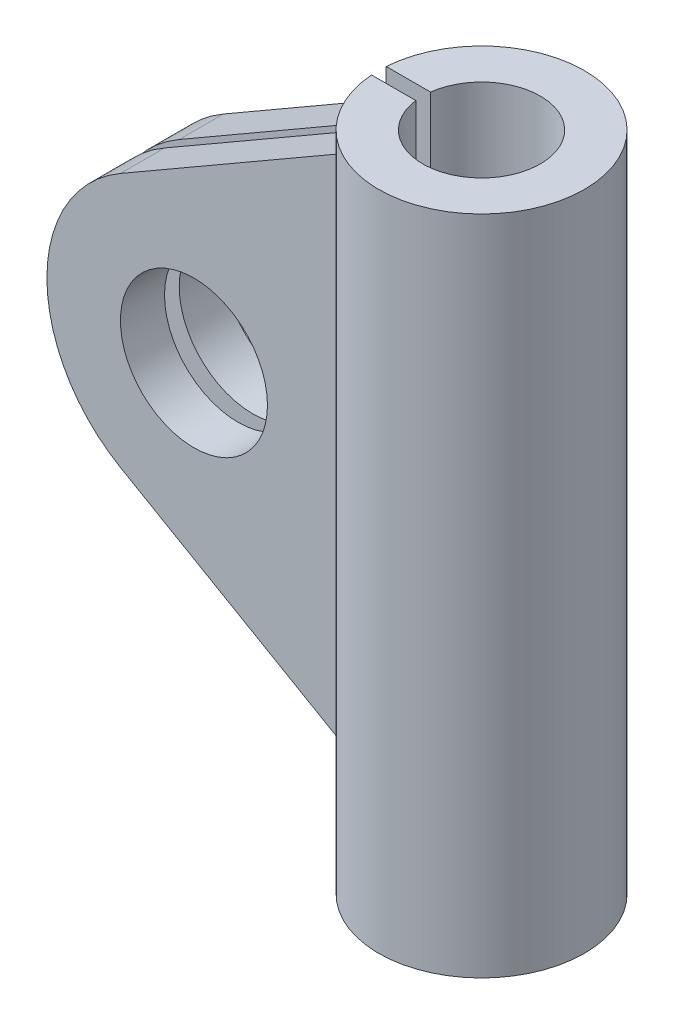
ISO-10303-21;
HEADER;
FILE_DESCRIPTION(('STEP AP214'),'2;1');
FILE_NAME('part.step','',(''),(''),'','','');
FILE_SCHEMA(('AUTOMOTIVE_DESIGN { 1 0 10303 214 1 1 1 1 }'));
ENDSEC;
DATA;
#1=APPLICATION_CONTEXT('core data for automotive mechanical design processes');
#2=APPLICATION_PROTOCOL_DEFINITION('international standard','automotive_design',2000,#1);
#3=PRODUCT_CONTEXT('',#1,'mechanical');
#4=PRODUCT('Part','Part','',(#3));
#5=PRODUCT_RELATED_PRODUCT_CATEGORY('part','',(#4));
#6=PRODUCT_DEFINITION_FORMATION('','',#4);
#7=PRODUCT_DEFINITION_CONTEXT('part definition',#1,'design');
#8=PRODUCT_DEFINITION('design','',#6,#7);
#9=PRODUCT_DEFINITION_SHAPE('','',#8);
#10=(LENGTH_UNIT() NAMED_UNIT(*) SI_UNIT(.MILLI.,.METRE.));
#11=(NAMED_UNIT(*) PLANE_ANGLE_UNIT() SI_UNIT($,.RADIAN.));
#12=(NAMED_UNIT(*) SI_UNIT($,.STERADIAN.) SOLID_ANGLE_UNIT());
#13=UNCERTAINTY_MEASURE_WITH_UNIT(LENGTH_MEASURE(1.E-05),#10,'distance_accuracy_value','');
#14=(GEOMETRIC_REPRESENTATION_CONTEXT(3) GLOBAL_UNCERTAINTY_ASSIGNED_CONTEXT((#13)) GLOBAL_UNIT_ASSIGNED_CONTEXT((#10,
#11,#12)) REPRESENTATION_CONTEXT('',''));
#15=CARTESIAN_POINT('',(0.,0.,0.));
#16=DIRECTION('',(0.,0.,1.));
#17=DIRECTION('',(1.,0.,0.));
#18=AXIS2_PLACEMENT_3D('',#15,#16,#17);
#19=CARTESIAN_POINT('',(0.,0.,7.));
#20=DIRECTION('',(0.,0.,-1.));
#21=DIRECTION('',(-1.,0.,0.));
#22=AXIS2_PLACEMENT_3D('',#19,#20,#21);
#23=CYLINDRICAL_SURFACE('',#22,10.);
#24=CARTESIAN_POINT('',(0.,0.,4.));
#25=DIRECTION('',(0.,0.,-1.));
#26=DIRECTION('',(-1.,0.,0.));
#27=AXIS2_PLACEMENT_3D('',#24,#25,#26);
#28=CIRCLE('',#27,10.);
#29=CARTESIAN_POINT('',(-5.00000000000005,-8.66025403784437,4.));
#30=VERTEX_POINT('',#29);
#31=CARTESIAN_POINT('',(-5.00000000000004,8.66025403784436,4.));
#32=VERTEX_POINT('',#31);
#33=EDGE_CURVE('E219',#30,#32,#28,.T.);
#34=ORIENTED_EDGE('',*,*,#33,.F.);
#35=DIRECTION('',(0.,0.,-1.));
#36=VECTOR('',#35,1.);
#37=CARTESIAN_POINT('',(-5.00000000000004,-8.66025403784437,7.));
#38=LINE('',#37,#36);
#39=CARTESIAN_POINT('',(-5.00000000000004,-8.66025403784437,7.));
#40=VERTEX_POINT('',#39);
#41=EDGE_CURVE('E11',#40,#30,#38,.T.);
#42=ORIENTED_EDGE('',*,*,#41,.F.);
#43=CARTESIAN_POINT('',(0.,0.,7.));
#44=DIRECTION('',(0.,0.,1.));
#45=DIRECTION('',(1.,0.,0.));
#46=AXIS2_PLACEMENT_3D('',#43,#44,#45);
#47=CIRCLE('',#46,10.);
#48=CARTESIAN_POINT('',(-5.00000000000004,8.66025403784436,7.));
#49=VERTEX_POINT('',#48);
#50=EDGE_CURVE('E108',#49,#40,#47,.T.);
#51=ORIENTED_EDGE('',*,*,#50,.F.);
#52=DIRECTION('',(0.,0.,-1.));
#53=VECTOR('',#52,1.);
#54=CARTESIAN_POINT('',(-5.00000000000004,8.66025403784436,7.));
#55=LINE('',#54,#53);
#56=EDGE_CURVE('E62',#49,#32,#55,.T.);
#57=ORIENTED_EDGE('',*,*,#56,.T.);
#58=EDGE_LOOP('',(#34,#42,#51,#57));
#59=FACE_BOUND('',#58,.T.);
#60=ADVANCED_FACE('F37',(#59),#23,.T.);
#61=CARTESIAN_POINT('',(-5.00000000000005,-8.66025403784437,7.));
#62=DIRECTION('',(0.500000000000004,0.866025403784436,0.));
#63=DIRECTION('',(-0.866025403784436,0.500000000000004,0.));
#64=AXIS2_PLACEMENT_3D('',#61,#62,#63);
#65=PLANE('',#64);
#66=DIRECTION('',(-0.866025403784436,0.500000000000004,0.));
#67=VECTOR('',#66,1.);
#68=CARTESIAN_POINT('',(-5.00000000000005,-8.66025403784437,4.));
#69=LINE('',#68,#67);
#70=CARTESIAN_POINT('',(9.0800578046066,-16.7893792015396,4.));
#71=VERTEX_POINT('',#70);
#72=EDGE_CURVE('E169',#71,#30,#69,.T.);
#73=ORIENTED_EDGE('',*,*,#72,.F.);
#74=CARTESIAN_POINT('',(16.0621778264911,-20.8205080756889,3.5));
#75=DIRECTION('',(0.500000000000004,0.866025403784436,0.));
#76=DIRECTION('',(-0.866025403784436,0.500000000000004,0.));
#77=AXIS2_PLACEMENT_3D('',#74,#75,#76);
#78=ELLIPSE('',#77,8.08290376865478,7.);
#79=CARTESIAN_POINT('',(10.,-17.3205080756889,7.));
#80=VERTEX_POINT('',#79);
#81=EDGE_CURVE('E164',#71,#80,#78,.T.);
#82=ORIENTED_EDGE('',*,*,#81,.T.);
#83=DIRECTION('',(0.866025403784436,-0.500000000000004,0.));
#84=VECTOR('',#83,1.);
#85=CARTESIAN_POINT('',(-5.00000000000005,-8.66025403784437,7.));
#86=LINE('',#85,#84);
#87=EDGE_CURVE('E112',#40,#80,#86,.T.);
#88=ORIENTED_EDGE('',*,*,#87,.F.);
#89=ORIENTED_EDGE('',*,*,#41,.T.);
#90=EDGE_LOOP('',(#73,#82,#88,#89));
#91=FACE_BOUND('',#90,.T.);
#92=ADVANCED_FACE('F166',(#91),#65,.F.);
#93=CARTESIAN_POINT('',(-5.00000000000004,8.66025403784436,7.));
#94=DIRECTION('',(-0.500000000000004,0.866025403784436,0.));
#95=DIRECTION('',(-0.866025403784436,-0.500000000000004,0.));
#96=AXIS2_PLACEMENT_3D('',#93,#94,#95);
#97=PLANE('',#96);
#98=CARTESIAN_POINT('',(16.0621778264911,20.8205080756889,3.5));
#99=DIRECTION('',(-0.500000000000004,0.866025403784436,0.));
#100=DIRECTION('',(0.866025403784436,0.500000000000004,0.));
#101=AXIS2_PLACEMENT_3D('',#98,#99,#100);
#102=ELLIPSE('',#101,8.08290376865478,7.);
#103=CARTESIAN_POINT('',(9.08005780460661,16.7893792015396,4.));
#104=VERTEX_POINT('',#103);
#105=CARTESIAN_POINT('',(10.,17.3205080756889,7.));
#106=VERTEX_POINT('',#105);
#107=EDGE_CURVE('E179',#104,#106,#102,.T.);
#108=ORIENTED_EDGE('',*,*,#107,.F.);
#109=DIRECTION('',(-0.866025403784436,-0.500000000000004,0.));
#110=VECTOR('',#109,1.);
#111=CARTESIAN_POINT('',(-5.00000000000004,8.66025403784436,4.));
#112=LINE('',#111,#110);
#113=EDGE_CURVE('E188',#104,#32,#112,.T.);
#114=ORIENTED_EDGE('',*,*,#113,.T.);
#115=ORIENTED_EDGE('',*,*,#56,.F.);
#116=DIRECTION('',(0.866025403784436,0.500000000000005,0.));
#117=VECTOR('',#116,1.);
#118=CARTESIAN_POINT('',(-5.00000000000004,8.66025403784436,7.));
#119=LINE('',#118,#117);
#120=EDGE_CURVE('E91',#49,#106,#119,.T.);
#121=ORIENTED_EDGE('',*,*,#120,.T.);
#122=EDGE_LOOP('',(#108,#114,#115,#121));
#123=FACE_BOUND('',#122,.T.);
#124=ADVANCED_FACE('F187',(#123),#97,.T.);
#125=CARTESIAN_POINT('',(16.0621778264911,-25.,3.5));
#126=DIRECTION('',(0.,1.,0.));
#127=DIRECTION('',(0.,0.,1.));
#128=AXIS2_PLACEMENT_3D('',#125,#126,#127);
#129=CYLINDRICAL_SURFACE('',#128,7.);
#130=CARTESIAN_POINT('',(16.0621778264911,20.,3.5));
#131=DIRECTION('',(0.,1.,0.));
#132=DIRECTION('',(0.,0.,1.));
#133=AXIS2_PLACEMENT_3D('',#130,#131,#132);
#134=CIRCLE('',#133,7.);
#135=CARTESIAN_POINT('',(9.0800578046066,20.,4.));
#136=VERTEX_POINT('',#135);
#137=CARTESIAN_POINT('',(9.0800578046066,20.,3.));
#138=VERTEX_POINT('',#137);
#139=EDGE_CURVE('E192',#136,#138,#134,.T.);
#140=ORIENTED_EDGE('',*,*,#139,.F.);
#141=DIRECTION('',(0.,1.,0.));
#142=VECTOR('',#141,1.);
#143=CARTESIAN_POINT('',(9.0800578046066,-25.,4.));
#144=LINE('',#143,#142);
#145=EDGE_CURVE('E217',#136,#104,#144,.F.);
#146=ORIENTED_EDGE('',*,*,#145,.T.);
#147=ORIENTED_EDGE('',*,*,#107,.T.);
#148=DIRECTION('',(0.,-1.,0.));
#149=VECTOR('',#148,1.);
#150=CARTESIAN_POINT('',(10.,0.,7.));
#151=LINE('',#150,#149);
#152=EDGE_CURVE('E174',#106,#80,#151,.T.);
#153=ORIENTED_EDGE('',*,*,#152,.T.);
#154=ORIENTED_EDGE('',*,*,#81,.F.);
#155=CARTESIAN_POINT('',(9.0800578046066,-25.,4.));
#156=VERTEX_POINT('',#155);
#157=EDGE_CURVE('E211',#71,#156,#144,.F.);
#158=ORIENTED_EDGE('',*,*,#157,.T.);
#159=CARTESIAN_POINT('',(16.0621778264911,-25.,3.5));
#160=DIRECTION('',(0.,1.,0.));
#161=DIRECTION('',(0.,0.,1.));
#162=AXIS2_PLACEMENT_3D('',#159,#160,#161);
#163=CIRCLE('',#162,7.);
#164=CARTESIAN_POINT('',(9.0800578046066,-25.,3.));
#165=VERTEX_POINT('',#164);
#166=EDGE_CURVE('E189',#156,#165,#163,.T.);
#167=ORIENTED_EDGE('',*,*,#166,.T.);
#168=DIRECTION('',(0.,1.,0.));
#169=VECTOR('',#168,1.);
#170=CARTESIAN_POINT('',(9.0800578046066,-25.,3.));
#171=LINE('',#170,#169);
#172=CARTESIAN_POINT('',(9.0800578046066,-16.7893792015396,3.));
#173=VERTEX_POINT('',#172);
#174=EDGE_CURVE('E197',#173,#165,#171,.F.);
#175=ORIENTED_EDGE('',*,*,#174,.F.);
#176=CARTESIAN_POINT('',(10.,-17.3205080756889,0.));
#177=VERTEX_POINT('',#176);
#178=EDGE_CURVE('E102',#177,#173,#78,.T.);
#179=ORIENTED_EDGE('',*,*,#178,.F.);
#180=DIRECTION('',(0.,-1.,0.));
#181=VECTOR('',#180,1.);
#182=CARTESIAN_POINT('',(10.,0.,0.));
#183=LINE('',#182,#181);
#184=CARTESIAN_POINT('',(10.,17.3205080756889,0.));
#185=VERTEX_POINT('',#184);
#186=EDGE_CURVE('E109',#185,#177,#183,.T.);
#187=ORIENTED_EDGE('',*,*,#186,.F.);
#188=CARTESIAN_POINT('',(9.08005780460661,16.7893792015396,3.));
#189=VERTEX_POINT('',#188);
#190=EDGE_CURVE('E107',#185,#189,#102,.T.);
#191=ORIENTED_EDGE('',*,*,#190,.T.);
#192=EDGE_CURVE('E203',#138,#189,#171,.F.);
#193=ORIENTED_EDGE('',*,*,#192,.F.);
#194=EDGE_LOOP('',(#140,#146,#147,#153,#154,#158,#167,#175,#179,#187,#191,#193));
#195=FACE_BOUND('',#194,.T.);
#196=ADVANCED_FACE('F176',(#195),#129,.T.);
#197=CARTESIAN_POINT('',(16.0621778264911,-25.,3.5));
#198=DIRECTION('',(0.,1.,0.));
#199=DIRECTION('',(0.,0.,1.));
#200=AXIS2_PLACEMENT_3D('',#197,#198,#199);
#201=PLANE('',#200);
#202=DIRECTION('',(-1.,0.,0.));
#203=VECTOR('',#202,1.);
#204=CARTESIAN_POINT('',(16.0621778264911,-25.,4.));
#205=LINE('',#204,#203);
#206=CARTESIAN_POINT('',(12.0935508598942,-25.,4.));
#207=VERTEX_POINT('',#206);
#208=EDGE_CURVE('E207',#207,#156,#205,.T.);
#209=ORIENTED_EDGE('',*,*,#208,.F.);
#210=CARTESIAN_POINT('',(16.0621778264911,-25.,3.5));
#211=DIRECTION('',(0.,1.,0.));
#212=DIRECTION('',(0.,0.,1.));
#213=AXIS2_PLACEMENT_3D('',#210,#211,#212);
#214=CIRCLE('',#213,4.);
#215=CARTESIAN_POINT('',(12.0935508598942,-25.,3.));
#216=VERTEX_POINT('',#215);
#217=EDGE_CURVE('E222',#207,#216,#214,.T.);
#218=ORIENTED_EDGE('',*,*,#217,.T.);
#219=DIRECTION('',(-1.,0.,0.));
#220=VECTOR('',#219,1.);
#221=CARTESIAN_POINT('',(16.0621778264911,-25.,3.));
#222=LINE('',#221,#220);
#223=EDGE_CURVE('E201',#216,#165,#222,.T.);
#224=ORIENTED_EDGE('',*,*,#223,.T.);
#225=ORIENTED_EDGE('',*,*,#166,.F.);
#226=EDGE_LOOP('',(#209,#218,#224,#225));
#227=FACE_BOUND('',#226,.T.);
#228=ADVANCED_FACE('F248',(#227),#201,.F.);
#229=CARTESIAN_POINT('',(16.0621778264911,20.,3.5));
#230=DIRECTION('',(0.,1.,0.));
#231=DIRECTION('',(0.,0.,1.));
#232=AXIS2_PLACEMENT_3D('',#229,#230,#231);
#233=PLANE('',#232);
#234=CARTESIAN_POINT('',(16.0621778264911,20.,3.5));
#235=DIRECTION('',(0.,1.,0.));
#236=DIRECTION('',(0.,0.,1.));
#237=AXIS2_PLACEMENT_3D('',#234,#235,#236);
#238=CIRCLE('',#237,4.);
#239=CARTESIAN_POINT('',(12.0935508598942,20.,4.));
#240=VERTEX_POINT('',#239);
#241=CARTESIAN_POINT('',(12.0935508598942,20.,3.));
#242=VERTEX_POINT('',#241);
#243=EDGE_CURVE('E53',#240,#242,#238,.T.);
#244=ORIENTED_EDGE('',*,*,#243,.F.);
#245=DIRECTION('',(-1.,0.,0.));
#246=VECTOR('',#245,1.);
#247=CARTESIAN_POINT('',(0.,20.,4.));
#248=LINE('',#247,#246);
#249=EDGE_CURVE('E232',#240,#136,#248,.T.);
#250=ORIENTED_EDGE('',*,*,#249,.T.);
#251=ORIENTED_EDGE('',*,*,#139,.T.);
#252=DIRECTION('',(-1.,0.,0.));
#253=VECTOR('',#252,1.);
#254=CARTESIAN_POINT('',(0.,20.,3.));
#255=LINE('',#254,#253);
#256=EDGE_CURVE('E230',#242,#138,#255,.T.);
#257=ORIENTED_EDGE('',*,*,#256,.F.);
#258=EDGE_LOOP('',(#244,#250,#251,#257));
#259=FACE_BOUND('',#258,.T.);
#260=ADVANCED_FACE('F229',(#259),#233,.T.);
#261=CARTESIAN_POINT('',(0.,0.,3.));
#262=DIRECTION('',(0.,0.,-1.));
#263=DIRECTION('',(-1.,0.,0.));
#264=AXIS2_PLACEMENT_3D('',#261,#262,#263);
#265=CIRCLE('',#264,10.);
#266=CARTESIAN_POINT('',(-5.00000000000005,-8.66025403784437,3.));
#267=VERTEX_POINT('',#266);
#268=CARTESIAN_POINT('',(-5.00000000000004,8.66025403784436,3.));
#269=VERTEX_POINT('',#268);
#270=EDGE_CURVE('E86',#267,#269,#265,.T.);
#271=ORIENTED_EDGE('',*,*,#270,.T.);
#272=CARTESIAN_POINT('',(-5.00000000000004,8.66025403784436,0.));
#273=VERTEX_POINT('',#272);
#274=EDGE_CURVE('E80',#269,#273,#55,.T.);
#275=ORIENTED_EDGE('',*,*,#274,.T.);
#276=CARTESIAN_POINT('',(0.,0.,0.));
#277=DIRECTION('',(0.,0.,1.));
#278=DIRECTION('',(1.,0.,0.));
#279=AXIS2_PLACEMENT_3D('',#276,#277,#278);
#280=CIRCLE('',#279,10.);
#281=CARTESIAN_POINT('',(-5.00000000000004,-8.66025403784437,0.));
#282=VERTEX_POINT('',#281);
#283=EDGE_CURVE('E83',#273,#282,#280,.T.);
#284=ORIENTED_EDGE('',*,*,#283,.T.);
#285=EDGE_CURVE('E46',#267,#282,#38,.T.);
#286=ORIENTED_EDGE('',*,*,#285,.F.);
#287=EDGE_LOOP('',(#271,#275,#284,#286));
#288=FACE_BOUND('',#287,.T.);
#289=ADVANCED_FACE('F39',(#288),#23,.T.);
#290=ORIENTED_EDGE('',*,*,#178,.T.);
#291=DIRECTION('',(-0.866025403784436,0.500000000000004,0.));
#292=VECTOR('',#291,1.);
#293=CARTESIAN_POINT('',(-5.00000000000005,-8.66025403784437,3.));
#294=LINE('',#293,#292);
#295=EDGE_CURVE('E125',#173,#267,#294,.T.);
#296=ORIENTED_EDGE('',*,*,#295,.T.);
#297=ORIENTED_EDGE('',*,*,#285,.T.);
#298=DIRECTION('',(0.866025403784436,-0.500000000000004,0.));
#299=VECTOR('',#298,1.);
#300=CARTESIAN_POINT('',(-5.00000000000005,-8.66025403784437,0.));
#301=LINE('',#300,#299);
#302=EDGE_CURVE('E101',#282,#177,#301,.T.);
#303=ORIENTED_EDGE('',*,*,#302,.T.);
#304=EDGE_LOOP('',(#290,#296,#297,#303));
#305=FACE_BOUND('',#304,.T.);
#306=ADVANCED_FACE('F122',(#305),#65,.F.);
#307=DIRECTION('',(-0.866025403784436,-0.500000000000004,0.));
#308=VECTOR('',#307,1.);
#309=CARTESIAN_POINT('',(-5.00000000000004,8.66025403784436,3.));
#310=LINE('',#309,#308);
#311=EDGE_CURVE('E208',#189,#269,#310,.T.);
#312=ORIENTED_EDGE('',*,*,#311,.F.);
#313=ORIENTED_EDGE('',*,*,#190,.F.);
#314=DIRECTION('',(0.866025403784436,0.500000000000005,0.));
#315=VECTOR('',#314,1.);
#316=CARTESIAN_POINT('',(-5.00000000000004,8.66025403784436,0.));
#317=LINE('',#316,#315);
#318=EDGE_CURVE('E99',#273,#185,#317,.T.);
#319=ORIENTED_EDGE('',*,*,#318,.F.);
#320=ORIENTED_EDGE('',*,*,#274,.F.);
#321=EDGE_LOOP('',(#312,#313,#319,#320));
#322=FACE_BOUND('',#321,.T.);
#323=ADVANCED_FACE('F105',(#322),#97,.T.);
#324=CARTESIAN_POINT('',(0.,0.,7.));
#325=DIRECTION('',(0.,0.,1.));
#326=DIRECTION('',(1.,0.,0.));
#327=AXIS2_PLACEMENT_3D('',#324,#325,#326);
#328=PLANE('',#327);
#329=CARTESIAN_POINT('',(0.,0.,7.));
#330=DIRECTION('',(0.,0.,1.));
#331=DIRECTION('',(1.,0.,0.));
#332=AXIS2_PLACEMENT_3D('',#329,#330,#331);
#333=CIRCLE('',#332,5.);
#334=CARTESIAN_POINT('',(5.,0.,7.));
#335=VERTEX_POINT('',#334);
#336=EDGE_CURVE('E372',#335,#335,#333,.T.);
#337=ORIENTED_EDGE('',*,*,#336,.F.);
#338=EDGE_LOOP('',(#337));
#339=FACE_BOUND('',#338,.T.);
#340=ORIENTED_EDGE('',*,*,#50,.T.);
#341=ORIENTED_EDGE('',*,*,#87,.T.);
#342=ORIENTED_EDGE('',*,*,#152,.F.);
#343=ORIENTED_EDGE('',*,*,#120,.F.);
#344=EDGE_LOOP('',(#340,#341,#342,#343));
#345=FACE_BOUND('',#344,.T.);
#346=ADVANCED_FACE('F183',(#339,#345),#328,.T.);
#347=CARTESIAN_POINT('',(0.,0.,0.));
#348=DIRECTION('',(0.,0.,1.));
#349=DIRECTION('',(1.,0.,0.));
#350=AXIS2_PLACEMENT_3D('',#347,#348,#349);
#351=PLANE('',#350);
#352=CARTESIAN_POINT('',(0.,0.,0.));
#353=DIRECTION('',(0.,0.,1.));
#354=DIRECTION('',(1.,0.,0.));
#355=AXIS2_PLACEMENT_3D('',#352,#353,#354);
#356=CIRCLE('',#355,5.);
#357=CARTESIAN_POINT('',(5.,0.,0.));
#358=VERTEX_POINT('',#357);
#359=EDGE_CURVE('E377',#358,#358,#356,.T.);
#360=ORIENTED_EDGE('',*,*,#359,.T.);
#361=EDGE_LOOP('',(#360));
#362=FACE_BOUND('',#361,.T.);
#363=ORIENTED_EDGE('',*,*,#283,.F.);
#364=ORIENTED_EDGE('',*,*,#318,.T.);
#365=ORIENTED_EDGE('',*,*,#186,.T.);
#366=ORIENTED_EDGE('',*,*,#302,.F.);
#367=EDGE_LOOP('',(#363,#364,#365,#366));
#368=FACE_BOUND('',#367,.T.);
#369=ADVANCED_FACE('F96',(#362,#368),#351,.F.);
#370=CARTESIAN_POINT('',(16.0621778264911,-35.,3.5));
#371=DIRECTION('',(0.,1.,0.));
#372=DIRECTION('',(0.,0.,1.));
#373=AXIS2_PLACEMENT_3D('',#370,#371,#372);
#374=CYLINDRICAL_SURFACE('',#373,4.);
#375=DIRECTION('',(0.,1.,0.));
#376=VECTOR('',#375,1.);
#377=CARTESIAN_POINT('',(12.0935508598942,-35.,4.));
#378=LINE('',#377,#376);
#379=EDGE_CURVE('E205',#207,#240,#378,.T.);
#380=ORIENTED_EDGE('',*,*,#379,.T.);
#381=ORIENTED_EDGE('',*,*,#243,.T.);
#382=DIRECTION('',(0.,1.,0.));
#383=VECTOR('',#382,1.);
#384=CARTESIAN_POINT('',(12.0935508598942,-35.,3.));
#385=LINE('',#384,#383);
#386=EDGE_CURVE('E383',#216,#242,#385,.T.);
#387=ORIENTED_EDGE('',*,*,#386,.F.);
#388=ORIENTED_EDGE('',*,*,#217,.F.);
#389=EDGE_LOOP('',(#380,#381,#387,#388));
#390=FACE_BOUND('',#389,.T.);
#391=ADVANCED_FACE('F256',(#390),#374,.F.);
#392=CARTESIAN_POINT('',(0.,-35.,4.));
#393=DIRECTION('',(0.,0.,-1.));
#394=DIRECTION('',(-1.,0.,0.));
#395=AXIS2_PLACEMENT_3D('',#392,#393,#394);
#396=PLANE('',#395);
#397=CARTESIAN_POINT('',(0.,0.,4.));
#398=DIRECTION('',(0.,0.,-1.));
#399=DIRECTION('',(-1.,0.,0.));
#400=AXIS2_PLACEMENT_3D('',#397,#398,#399);
#401=CIRCLE('',#400,5.);
#402=CARTESIAN_POINT('',(-5.,0.,4.));
#403=VERTEX_POINT('',#402);
#404=EDGE_CURVE('E369',#403,#403,#401,.T.);
#405=ORIENTED_EDGE('',*,*,#404,.F.);
#406=EDGE_LOOP('',(#405));
#407=FACE_BOUND('',#406,.T.);
#408=ORIENTED_EDGE('',*,*,#249,.F.);
#409=ORIENTED_EDGE('',*,*,#379,.F.);
#410=ORIENTED_EDGE('',*,*,#208,.T.);
#411=ORIENTED_EDGE('',*,*,#157,.F.);
#412=ORIENTED_EDGE('',*,*,#72,.T.);
#413=ORIENTED_EDGE('',*,*,#33,.T.);
#414=ORIENTED_EDGE('',*,*,#113,.F.);
#415=ORIENTED_EDGE('',*,*,#145,.F.);
#416=EDGE_LOOP('',(#408,#409,#410,#411,#412,#413,#414,#415));
#417=FACE_BOUND('',#416,.T.);
#418=ADVANCED_FACE('F237',(#407,#417),#396,.T.);
#419=CARTESIAN_POINT('',(0.,-35.,3.));
#420=DIRECTION('',(0.,0.,-1.));
#421=DIRECTION('',(-1.,0.,0.));
#422=AXIS2_PLACEMENT_3D('',#419,#420,#421);
#423=PLANE('',#422);
#424=CARTESIAN_POINT('',(0.,0.,3.));
#425=DIRECTION('',(0.,0.,-1.));
#426=DIRECTION('',(-1.,0.,0.));
#427=AXIS2_PLACEMENT_3D('',#424,#425,#426);
#428=CIRCLE('',#427,5.);
#429=CARTESIAN_POINT('',(-5.,0.,3.));
#430=VERTEX_POINT('',#429);
#431=EDGE_CURVE('E41',#430,#430,#428,.T.);
#432=ORIENTED_EDGE('',*,*,#431,.T.);
#433=EDGE_LOOP('',(#432));
#434=FACE_BOUND('',#433,.T.);
#435=ORIENTED_EDGE('',*,*,#192,.T.);
#436=ORIENTED_EDGE('',*,*,#311,.T.);
#437=ORIENTED_EDGE('',*,*,#270,.F.);
#438=ORIENTED_EDGE('',*,*,#295,.F.);
#439=ORIENTED_EDGE('',*,*,#174,.T.);
#440=ORIENTED_EDGE('',*,*,#223,.F.);
#441=ORIENTED_EDGE('',*,*,#386,.T.);
#442=ORIENTED_EDGE('',*,*,#256,.T.);
#443=EDGE_LOOP('',(#435,#436,#437,#438,#439,#440,#441,#442));
#444=FACE_BOUND('',#443,.T.);
#445=ADVANCED_FACE('F334',(#434,#444),#423,.F.);
#446=CARTESIAN_POINT('',(0.,0.,-48.));
#447=DIRECTION('',(0.,0.,1.));
#448=DIRECTION('',(1.,0.,0.));
#449=AXIS2_PLACEMENT_3D('',#446,#447,#448);
#450=CYLINDRICAL_SURFACE('',#449,5.);
#451=ORIENTED_EDGE('',*,*,#431,.F.);
#452=EDGE_LOOP('',(#451));
#453=FACE_BOUND('',#452,.T.);
#454=ORIENTED_EDGE('',*,*,#359,.F.);
#455=EDGE_LOOP('',(#454));
#456=FACE_BOUND('',#455,.T.);
#457=ADVANCED_FACE('F344',(#453,#456),#450,.F.);
#458=ORIENTED_EDGE('',*,*,#404,.T.);
#459=EDGE_LOOP('',(#458));
#460=FACE_BOUND('',#459,.T.);
#461=ORIENTED_EDGE('',*,*,#336,.T.);
#462=EDGE_LOOP('',(#461));
#463=FACE_BOUND('',#462,.T.);
#464=ADVANCED_FACE('F353',(#460,#463),#450,.F.);
#465=CLOSED_SHELL('',(#60,#92,#124,#196,#228,#260,#289,#306,#323,#346,#369,#391,#418,#445,#457,#464));
#466=MANIFOLD_SOLID_BREP('B2',#465);
#467=ADVANCED_BREP_SHAPE_REPRESENTATION('',(#18,#466),#14);
#468=SHAPE_DEFINITION_REPRESENTATION(#9,#467);
ENDSEC;
END-ISO-10303-21;
